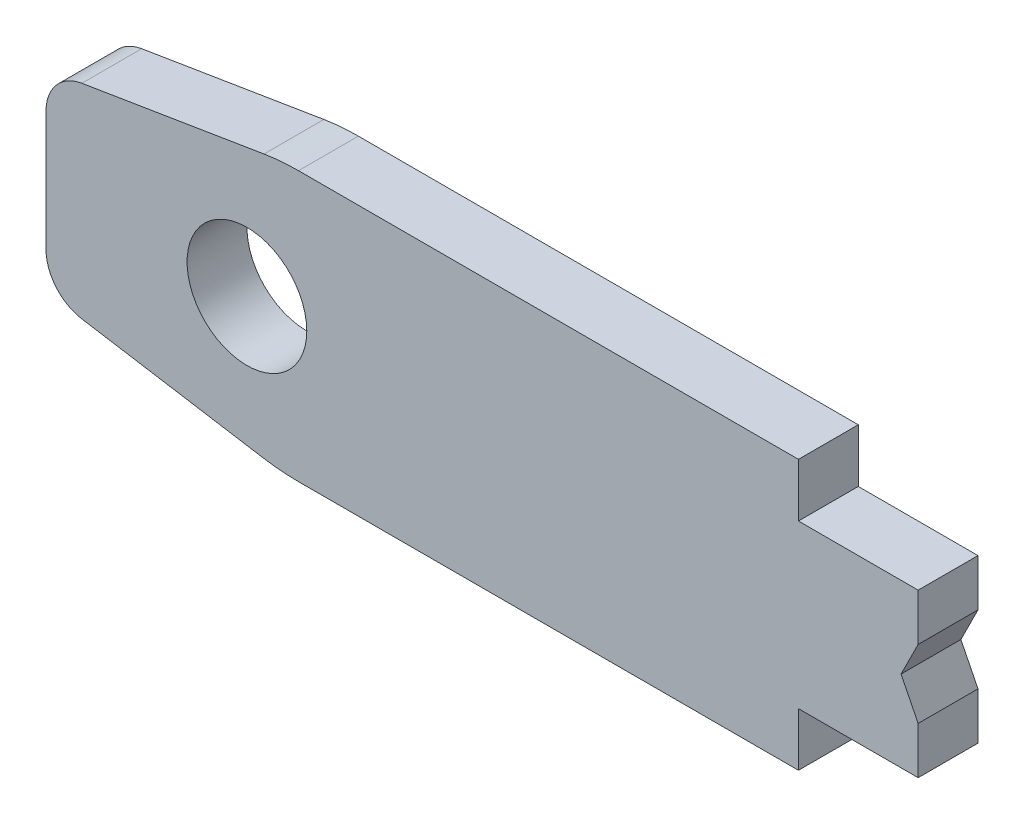
ISO-10303-21;
HEADER;
FILE_DESCRIPTION(('STEP AP214'),'2;1');
FILE_NAME('part.step','',(''),(''),'','','');
FILE_SCHEMA(('AUTOMOTIVE_DESIGN { 1 0 10303 214 1 1 1 1 }'));
ENDSEC;
DATA;
#1=APPLICATION_CONTEXT('core data for automotive mechanical design processes');
#2=APPLICATION_PROTOCOL_DEFINITION('international standard','automotive_design',2000,#1);
#3=PRODUCT_CONTEXT('',#1,'mechanical');
#4=PRODUCT('Part','Part','',(#3));
#5=PRODUCT_RELATED_PRODUCT_CATEGORY('part','',(#4));
#6=PRODUCT_DEFINITION_FORMATION('','',#4);
#7=PRODUCT_DEFINITION_CONTEXT('part definition',#1,'design');
#8=PRODUCT_DEFINITION('design','',#6,#7);
#9=PRODUCT_DEFINITION_SHAPE('','',#8);
#10=(LENGTH_UNIT() NAMED_UNIT(*) SI_UNIT(.MILLI.,.METRE.));
#11=(NAMED_UNIT(*) PLANE_ANGLE_UNIT() SI_UNIT($,.RADIAN.));
#12=(NAMED_UNIT(*) SI_UNIT($,.STERADIAN.) SOLID_ANGLE_UNIT());
#13=UNCERTAINTY_MEASURE_WITH_UNIT(LENGTH_MEASURE(1.E-05),#10,'distance_accuracy_value','');
#14=(GEOMETRIC_REPRESENTATION_CONTEXT(3) GLOBAL_UNCERTAINTY_ASSIGNED_CONTEXT((#13)) GLOBAL_UNIT_ASSIGNED_CONTEXT((#10,
#11,#12)) REPRESENTATION_CONTEXT('',''));
#15=CARTESIAN_POINT('',(0.,0.,0.));
#16=DIRECTION('',(0.,0.,1.));
#17=DIRECTION('',(1.,0.,0.));
#18=AXIS2_PLACEMENT_3D('',#15,#16,#17);
#19=CARTESIAN_POINT('',(-9.19999999999998,1.40033637868416,1.4));
#20=DIRECTION('',(0.,0.,1.));
#21=DIRECTION('',(1.,0.,0.));
#22=AXIS2_PLACEMENT_3D('',#19,#20,#21);
#23=PLANE('',#22);
#24=CARTESIAN_POINT('',(-9.19999999999998,1.40033637868416,1.4));
#25=DIRECTION('',(0.,0.,1.));
#26=DIRECTION('',(1.,0.,0.));
#27=AXIS2_PLACEMENT_3D('',#24,#25,#26);
#28=CIRCLE('',#27,1.);
#29=CARTESIAN_POINT('',(-9.36148856811052,2.38721096158191,1.4));
#30=VERTEX_POINT('',#29);
#31=CARTESIAN_POINT('',(-10.2,1.40033637868416,1.4));
#32=VERTEX_POINT('',#31);
#33=EDGE_CURVE('E216',#30,#32,#28,.T.);
#34=ORIENTED_EDGE('',*,*,#33,.T.);
#35=DIRECTION('',(0.,-1.,0.));
#36=VECTOR('',#35,1.);
#37=CARTESIAN_POINT('',(-10.2,-1.40033637868416,1.4));
#38=LINE('',#37,#36);
#39=CARTESIAN_POINT('',(-10.2,-1.40033637868416,1.4));
#40=VERTEX_POINT('',#39);
#41=EDGE_CURVE('E119',#32,#40,#38,.T.);
#42=ORIENTED_EDGE('',*,*,#41,.T.);
#43=CARTESIAN_POINT('',(-9.19999999999998,-1.40033637868416,1.4));
#44=DIRECTION('',(0.,0.,1.));
#45=DIRECTION('',(1.,0.,0.));
#46=AXIS2_PLACEMENT_3D('',#43,#44,#45);
#47=CIRCLE('',#46,1.);
#48=CARTESIAN_POINT('',(-9.36148856811052,-2.38721096158191,1.4));
#49=VERTEX_POINT('',#48);
#50=EDGE_CURVE('E258',#40,#49,#47,.T.);
#51=ORIENTED_EDGE('',*,*,#50,.T.);
#52=DIRECTION('',(0.98687458289775,-0.161488568110541,0.));
#53=VECTOR('',#52,1.);
#54=CARTESIAN_POINT('',(-9.36148856811052,-2.38721096158191,1.4));
#55=LINE('',#54,#53);
#56=CARTESIAN_POINT('',(-5.10105441145764,-3.08437291448875,1.4));
#57=VERTEX_POINT('',#56);
#58=EDGE_CURVE('E277',#49,#57,#55,.T.);
#59=ORIENTED_EDGE('',*,*,#58,.T.);
#60=CARTESIAN_POINT('',(-4.29361157090493,1.85,1.4));
#61=DIRECTION('',(0.,0.,1.));
#62=DIRECTION('',(1.,0.,0.));
#63=AXIS2_PLACEMENT_3D('',#60,#61,#62);
#64=CIRCLE('',#63,5.);
#65=CARTESIAN_POINT('',(-4.29361157090493,-3.15,1.4));
#66=VERTEX_POINT('',#65);
#67=EDGE_CURVE('E274',#57,#66,#64,.T.);
#68=ORIENTED_EDGE('',*,*,#67,.T.);
#69=DIRECTION('',(1.,0.,0.));
#70=VECTOR('',#69,1.);
#71=CARTESIAN_POINT('',(-4.29361157090493,-3.15,1.4));
#72=LINE('',#71,#70);
#73=CARTESIAN_POINT('',(7.40000000000002,-3.15,1.4));
#74=VERTEX_POINT('',#73);
#75=EDGE_CURVE('E276',#66,#74,#72,.T.);
#76=ORIENTED_EDGE('',*,*,#75,.T.);
#77=DIRECTION('',(0.,1.,0.));
#78=VECTOR('',#77,1.);
#79=CARTESIAN_POINT('',(7.40000000000002,-3.15,1.4));
#80=LINE('',#79,#78);
#81=CARTESIAN_POINT('',(7.40000000000002,-1.9,1.4));
#82=VERTEX_POINT('',#81);
#83=EDGE_CURVE('E279',#74,#82,#80,.T.);
#84=ORIENTED_EDGE('',*,*,#83,.T.);
#85=DIRECTION('',(1.,0.,0.));
#86=VECTOR('',#85,1.);
#87=CARTESIAN_POINT('',(10.2,-1.9,1.4));
#88=LINE('',#87,#86);
#89=CARTESIAN_POINT('',(10.2,-1.9,1.4));
#90=VERTEX_POINT('',#89);
#91=EDGE_CURVE('E285',#82,#90,#88,.T.);
#92=ORIENTED_EDGE('',*,*,#91,.T.);
#93=DIRECTION('',(0.,1.,0.));
#94=VECTOR('',#93,1.);
#95=CARTESIAN_POINT('',(10.2,-1.9,1.4));
#96=LINE('',#95,#94);
#97=CARTESIAN_POINT('',(10.2,-0.8,1.4));
#98=VERTEX_POINT('',#97);
#99=EDGE_CURVE('E287',#90,#98,#96,.T.);
#100=ORIENTED_EDGE('',*,*,#99,.T.);
#101=DIRECTION('',(-0.447213595499957,0.894427190999916,0.));
#102=VECTOR('',#101,1.);
#103=CARTESIAN_POINT('',(9.80000000000002,0.,1.4));
#104=LINE('',#103,#102);
#105=CARTESIAN_POINT('',(9.80000000000002,0.,1.4));
#106=VERTEX_POINT('',#105);
#107=EDGE_CURVE('E289',#98,#106,#104,.T.);
#108=ORIENTED_EDGE('',*,*,#107,.T.);
#109=DIRECTION('',(0.447213595499957,0.894427190999916,0.));
#110=VECTOR('',#109,1.);
#111=CARTESIAN_POINT('',(10.2,0.8,1.4));
#112=LINE('',#111,#110);
#113=CARTESIAN_POINT('',(10.2,0.8,1.4));
#114=VERTEX_POINT('',#113);
#115=EDGE_CURVE('E291',#106,#114,#112,.T.);
#116=ORIENTED_EDGE('',*,*,#115,.T.);
#117=DIRECTION('',(0.,1.,0.));
#118=VECTOR('',#117,1.);
#119=CARTESIAN_POINT('',(10.2,0.8,1.4));
#120=LINE('',#119,#118);
#121=CARTESIAN_POINT('',(10.2,1.9,1.4));
#122=VERTEX_POINT('',#121);
#123=EDGE_CURVE('E293',#114,#122,#120,.T.);
#124=ORIENTED_EDGE('',*,*,#123,.T.);
#125=DIRECTION('',(-1.,0.,0.));
#126=VECTOR('',#125,1.);
#127=CARTESIAN_POINT('',(7.40000000000002,1.9,1.4));
#128=LINE('',#127,#126);
#129=CARTESIAN_POINT('',(7.40000000000002,1.9,1.4));
#130=VERTEX_POINT('',#129);
#131=EDGE_CURVE('E295',#122,#130,#128,.T.);
#132=ORIENTED_EDGE('',*,*,#131,.T.);
#133=DIRECTION('',(0.,1.,0.));
#134=VECTOR('',#133,1.);
#135=CARTESIAN_POINT('',(7.40000000000002,3.15000000000002,1.4));
#136=LINE('',#135,#134);
#137=CARTESIAN_POINT('',(7.40000000000002,3.15000000000002,1.4));
#138=VERTEX_POINT('',#137);
#139=EDGE_CURVE('E165',#130,#138,#136,.T.);
#140=ORIENTED_EDGE('',*,*,#139,.T.);
#141=DIRECTION('',(-1.,0.,0.));
#142=VECTOR('',#141,1.);
#143=CARTESIAN_POINT('',(-4.29361157090493,3.15,1.4));
#144=LINE('',#143,#142);
#145=CARTESIAN_POINT('',(-4.29361157090493,3.15,1.4));
#146=VERTEX_POINT('',#145);
#147=EDGE_CURVE('E159',#138,#146,#144,.T.);
#148=ORIENTED_EDGE('',*,*,#147,.T.);
#149=CARTESIAN_POINT('',(-4.29361157090493,-1.85,1.4));
#150=DIRECTION('',(0.,0.,1.));
#151=DIRECTION('',(-1.,0.,0.));
#152=AXIS2_PLACEMENT_3D('',#149,#150,#151);
#153=CIRCLE('',#152,5.);
#154=CARTESIAN_POINT('',(-5.10105441145763,3.08437291448875,1.4));
#155=VERTEX_POINT('',#154);
#156=EDGE_CURVE('E163',#146,#155,#153,.T.);
#157=ORIENTED_EDGE('',*,*,#156,.T.);
#158=DIRECTION('',(-0.98687458289775,-0.16148856811054,0.));
#159=VECTOR('',#158,1.);
#160=CARTESIAN_POINT('',(-5.10105441145763,3.08437291448875,1.4));
#161=LINE('',#160,#159);
#162=EDGE_CURVE('E49',#155,#30,#161,.T.);
#163=ORIENTED_EDGE('',*,*,#162,.T.);
#164=EDGE_LOOP('',(#34,#42,#51,#59,#68,#76,#84,#92,#100,#108,#116,#124,#132,#140,#148,#157,#163));
#165=FACE_BOUND('',#164,.T.);
#166=CARTESIAN_POINT('',(-5.49999999999998,0.,1.4));
#167=DIRECTION('',(0.,0.,1.));
#168=DIRECTION('',(1.,0.,0.));
#169=AXIS2_PLACEMENT_3D('',#166,#167,#168);
#170=CIRCLE('',#169,1.4);
#171=CARTESIAN_POINT('',(-4.09999999999998,0.,1.4));
#172=VERTEX_POINT('',#171);
#173=EDGE_CURVE('E187',#172,#172,#170,.T.);
#174=ORIENTED_EDGE('',*,*,#173,.F.);
#175=EDGE_LOOP('',(#174));
#176=FACE_BOUND('',#175,.T.);
#177=ADVANCED_FACE('F32',(#165,#176),#23,.T.);
#178=CARTESIAN_POINT('',(-9.19999999999998,1.40033637868416,0.));
#179=DIRECTION('',(0.,0.,1.));
#180=DIRECTION('',(1.,0.,0.));
#181=AXIS2_PLACEMENT_3D('',#178,#179,#180);
#182=PLANE('',#181);
#183=CARTESIAN_POINT('',(-9.19999999999998,1.40033637868416,0.));
#184=DIRECTION('',(0.,0.,1.));
#185=DIRECTION('',(1.,0.,0.));
#186=AXIS2_PLACEMENT_3D('',#183,#184,#185);
#187=CIRCLE('',#186,1.);
#188=CARTESIAN_POINT('',(-9.36148856811052,2.38721096158191,0.));
#189=VERTEX_POINT('',#188);
#190=CARTESIAN_POINT('',(-10.2,1.40033637868416,0.));
#191=VERTEX_POINT('',#190);
#192=EDGE_CURVE('E183',#189,#191,#187,.T.);
#193=ORIENTED_EDGE('',*,*,#192,.F.);
#194=DIRECTION('',(-0.98687458289775,-0.16148856811054,0.));
#195=VECTOR('',#194,1.);
#196=CARTESIAN_POINT('',(-5.10105441145763,3.08437291448875,0.));
#197=LINE('',#196,#195);
#198=CARTESIAN_POINT('',(-5.10105441145763,3.08437291448875,0.));
#199=VERTEX_POINT('',#198);
#200=EDGE_CURVE('E111',#199,#189,#197,.T.);
#201=ORIENTED_EDGE('',*,*,#200,.F.);
#202=CARTESIAN_POINT('',(-4.29361157090493,-1.85,0.));
#203=DIRECTION('',(0.,0.,1.));
#204=DIRECTION('',(-1.,0.,0.));
#205=AXIS2_PLACEMENT_3D('',#202,#203,#204);
#206=CIRCLE('',#205,5.);
#207=CARTESIAN_POINT('',(-4.29361157090493,3.15,0.));
#208=VERTEX_POINT('',#207);
#209=EDGE_CURVE('E105',#208,#199,#206,.T.);
#210=ORIENTED_EDGE('',*,*,#209,.F.);
#211=DIRECTION('',(-1.,0.,0.));
#212=VECTOR('',#211,1.);
#213=CARTESIAN_POINT('',(-4.29361157090493,3.15,0.));
#214=LINE('',#213,#212);
#215=CARTESIAN_POINT('',(7.40000000000002,3.15000000000002,0.));
#216=VERTEX_POINT('',#215);
#217=EDGE_CURVE('E173',#216,#208,#214,.T.);
#218=ORIENTED_EDGE('',*,*,#217,.F.);
#219=DIRECTION('',(0.,1.,0.));
#220=VECTOR('',#219,1.);
#221=CARTESIAN_POINT('',(7.40000000000002,3.15000000000002,0.));
#222=LINE('',#221,#220);
#223=CARTESIAN_POINT('',(7.40000000000002,1.9,0.));
#224=VERTEX_POINT('',#223);
#225=EDGE_CURVE('E211',#224,#216,#222,.T.);
#226=ORIENTED_EDGE('',*,*,#225,.F.);
#227=DIRECTION('',(-1.,0.,0.));
#228=VECTOR('',#227,1.);
#229=CARTESIAN_POINT('',(7.40000000000002,1.9,0.));
#230=LINE('',#229,#228);
#231=CARTESIAN_POINT('',(10.2,1.9,0.));
#232=VERTEX_POINT('',#231);
#233=EDGE_CURVE('E209',#232,#224,#230,.T.);
#234=ORIENTED_EDGE('',*,*,#233,.F.);
#235=DIRECTION('',(0.,1.,0.));
#236=VECTOR('',#235,1.);
#237=CARTESIAN_POINT('',(10.2,0.8,0.));
#238=LINE('',#237,#236);
#239=CARTESIAN_POINT('',(10.2,0.8,0.));
#240=VERTEX_POINT('',#239);
#241=EDGE_CURVE('E207',#240,#232,#238,.T.);
#242=ORIENTED_EDGE('',*,*,#241,.F.);
#243=DIRECTION('',(0.447213595499957,0.894427190999916,0.));
#244=VECTOR('',#243,1.);
#245=CARTESIAN_POINT('',(10.2,0.8,0.));
#246=LINE('',#245,#244);
#247=CARTESIAN_POINT('',(9.80000000000002,0.,0.));
#248=VERTEX_POINT('',#247);
#249=EDGE_CURVE('E205',#248,#240,#246,.T.);
#250=ORIENTED_EDGE('',*,*,#249,.F.);
#251=DIRECTION('',(-0.447213595499957,0.894427190999916,0.));
#252=VECTOR('',#251,1.);
#253=CARTESIAN_POINT('',(9.80000000000002,0.,0.));
#254=LINE('',#253,#252);
#255=CARTESIAN_POINT('',(10.2,-0.8,0.));
#256=VERTEX_POINT('',#255);
#257=EDGE_CURVE('E203',#256,#248,#254,.T.);
#258=ORIENTED_EDGE('',*,*,#257,.F.);
#259=DIRECTION('',(0.,1.,0.));
#260=VECTOR('',#259,1.);
#261=CARTESIAN_POINT('',(10.2,-1.9,0.));
#262=LINE('',#261,#260);
#263=CARTESIAN_POINT('',(10.2,-1.9,0.));
#264=VERTEX_POINT('',#263);
#265=EDGE_CURVE('E201',#264,#256,#262,.T.);
#266=ORIENTED_EDGE('',*,*,#265,.F.);
#267=DIRECTION('',(1.,0.,0.));
#268=VECTOR('',#267,1.);
#269=CARTESIAN_POINT('',(10.2,-1.9,0.));
#270=LINE('',#269,#268);
#271=CARTESIAN_POINT('',(7.40000000000002,-1.9,0.));
#272=VERTEX_POINT('',#271);
#273=EDGE_CURVE('E199',#272,#264,#270,.T.);
#274=ORIENTED_EDGE('',*,*,#273,.F.);
#275=DIRECTION('',(0.,1.,0.));
#276=VECTOR('',#275,1.);
#277=CARTESIAN_POINT('',(7.40000000000002,-3.15,0.));
#278=LINE('',#277,#276);
#279=CARTESIAN_POINT('',(7.40000000000002,-3.15,0.));
#280=VERTEX_POINT('',#279);
#281=EDGE_CURVE('E197',#280,#272,#278,.T.);
#282=ORIENTED_EDGE('',*,*,#281,.F.);
#283=DIRECTION('',(1.,0.,0.));
#284=VECTOR('',#283,1.);
#285=CARTESIAN_POINT('',(-4.29361157090493,-3.15,0.));
#286=LINE('',#285,#284);
#287=CARTESIAN_POINT('',(-4.29361157090493,-3.15,0.));
#288=VERTEX_POINT('',#287);
#289=EDGE_CURVE('E195',#288,#280,#286,.T.);
#290=ORIENTED_EDGE('',*,*,#289,.F.);
#291=CARTESIAN_POINT('',(-4.29361157090493,1.85,0.));
#292=DIRECTION('',(0.,0.,1.));
#293=DIRECTION('',(1.,0.,0.));
#294=AXIS2_PLACEMENT_3D('',#291,#292,#293);
#295=CIRCLE('',#294,5.);
#296=CARTESIAN_POINT('',(-5.10105441145764,-3.08437291448875,0.));
#297=VERTEX_POINT('',#296);
#298=EDGE_CURVE('E193',#297,#288,#295,.T.);
#299=ORIENTED_EDGE('',*,*,#298,.F.);
#300=DIRECTION('',(0.98687458289775,-0.161488568110541,0.));
#301=VECTOR('',#300,1.);
#302=CARTESIAN_POINT('',(-9.36148856811052,-2.38721096158191,0.));
#303=LINE('',#302,#301);
#304=CARTESIAN_POINT('',(-9.36148856811052,-2.38721096158191,0.));
#305=VERTEX_POINT('',#304);
#306=EDGE_CURVE('E191',#305,#297,#303,.T.);
#307=ORIENTED_EDGE('',*,*,#306,.F.);
#308=CARTESIAN_POINT('',(-9.19999999999998,-1.40033637868416,0.));
#309=DIRECTION('',(0.,0.,1.));
#310=DIRECTION('',(1.,0.,0.));
#311=AXIS2_PLACEMENT_3D('',#308,#309,#310);
#312=CIRCLE('',#311,1.);
#313=CARTESIAN_POINT('',(-10.2,-1.40033637868416,0.));
#314=VERTEX_POINT('',#313);
#315=EDGE_CURVE('E189',#314,#305,#312,.T.);
#316=ORIENTED_EDGE('',*,*,#315,.F.);
#317=DIRECTION('',(0.,-1.,0.));
#318=VECTOR('',#317,1.);
#319=CARTESIAN_POINT('',(-10.2,-1.40033637868416,0.));
#320=LINE('',#319,#318);
#321=EDGE_CURVE('E186',#191,#314,#320,.T.);
#322=ORIENTED_EDGE('',*,*,#321,.F.);
#323=EDGE_LOOP('',(#193,#201,#210,#218,#226,#234,#242,#250,#258,#266,#274,#282,#290,#299,#307,
#316,#322));
#324=FACE_BOUND('',#323,.T.);
#325=CARTESIAN_POINT('',(-5.49999999999998,0.,0.));
#326=DIRECTION('',(0.,0.,1.));
#327=DIRECTION('',(1.,0.,0.));
#328=AXIS2_PLACEMENT_3D('',#325,#326,#327);
#329=CIRCLE('',#328,1.4);
#330=CARTESIAN_POINT('',(-4.09999999999998,0.,0.));
#331=VERTEX_POINT('',#330);
#332=EDGE_CURVE('E507',#331,#331,#329,.T.);
#333=ORIENTED_EDGE('',*,*,#332,.T.);
#334=EDGE_LOOP('',(#333));
#335=FACE_BOUND('',#334,.T.);
#336=ADVANCED_FACE('F262',(#324,#335),#182,.F.);
#337=CARTESIAN_POINT('',(-9.19999999999998,1.40033637868416,1.4));
#338=DIRECTION('',(0.,0.,-1.));
#339=DIRECTION('',(-1.,0.,0.));
#340=AXIS2_PLACEMENT_3D('',#337,#338,#339);
#341=CYLINDRICAL_SURFACE('',#340,1.);
#342=ORIENTED_EDGE('',*,*,#192,.T.);
#343=DIRECTION('',(0.,0.,-1.));
#344=VECTOR('',#343,1.);
#345=CARTESIAN_POINT('',(-10.2,1.40033637868416,1.4));
#346=LINE('',#345,#344);
#347=EDGE_CURVE('E11',#32,#191,#346,.T.);
#348=ORIENTED_EDGE('',*,*,#347,.F.);
#349=ORIENTED_EDGE('',*,*,#33,.F.);
#350=DIRECTION('',(0.,0.,-1.));
#351=VECTOR('',#350,1.);
#352=CARTESIAN_POINT('',(-9.36148856811052,2.38721096158191,1.4));
#353=LINE('',#352,#351);
#354=EDGE_CURVE('E179',#30,#189,#353,.T.);
#355=ORIENTED_EDGE('',*,*,#354,.T.);
#356=EDGE_LOOP('',(#342,#348,#349,#355));
#357=FACE_BOUND('',#356,.T.);
#358=ADVANCED_FACE('F34',(#357),#341,.T.);
#359=CARTESIAN_POINT('',(-10.2,-1.40033637868416,1.4));
#360=DIRECTION('',(1.,0.,0.));
#361=DIRECTION('',(0.,0.,-1.));
#362=AXIS2_PLACEMENT_3D('',#359,#360,#361);
#363=PLANE('',#362);
#364=ORIENTED_EDGE('',*,*,#321,.T.);
#365=DIRECTION('',(0.,0.,-1.));
#366=VECTOR('',#365,1.);
#367=CARTESIAN_POINT('',(-10.2,-1.40033637868416,1.4));
#368=LINE('',#367,#366);
#369=EDGE_CURVE('E41',#40,#314,#368,.T.);
#370=ORIENTED_EDGE('',*,*,#369,.F.);
#371=ORIENTED_EDGE('',*,*,#41,.F.);
#372=ORIENTED_EDGE('',*,*,#347,.T.);
#373=EDGE_LOOP('',(#364,#370,#371,#372));
#374=FACE_BOUND('',#373,.T.);
#375=ADVANCED_FACE('F329',(#374),#363,.F.);
#376=CARTESIAN_POINT('',(-9.19999999999998,-1.40033637868416,1.4));
#377=DIRECTION('',(0.,0.,-1.));
#378=DIRECTION('',(-1.,0.,0.));
#379=AXIS2_PLACEMENT_3D('',#376,#377,#378);
#380=CYLINDRICAL_SURFACE('',#379,1.);
#381=ORIENTED_EDGE('',*,*,#315,.T.);
#382=DIRECTION('',(0.,0.,-1.));
#383=VECTOR('',#382,1.);
#384=CARTESIAN_POINT('',(-9.36148856811052,-2.38721096158191,1.4));
#385=LINE('',#384,#383);
#386=EDGE_CURVE('E250',#49,#305,#385,.T.);
#387=ORIENTED_EDGE('',*,*,#386,.F.);
#388=ORIENTED_EDGE('',*,*,#50,.F.);
#389=ORIENTED_EDGE('',*,*,#369,.T.);
#390=EDGE_LOOP('',(#381,#387,#388,#389));
#391=FACE_BOUND('',#390,.T.);
#392=ADVANCED_FACE('F256',(#391),#380,.T.);
#393=CARTESIAN_POINT('',(-9.36148856811052,-2.38721096158191,1.4));
#394=DIRECTION('',(0.161488568110541,0.98687458289775,0.));
#395=DIRECTION('',(-0.98687458289775,0.161488568110541,0.));
#396=AXIS2_PLACEMENT_3D('',#393,#394,#395);
#397=PLANE('',#396);
#398=ORIENTED_EDGE('',*,*,#306,.T.);
#399=DIRECTION('',(0.,0.,-1.));
#400=VECTOR('',#399,1.);
#401=CARTESIAN_POINT('',(-5.10105441145764,-3.08437291448875,1.4));
#402=LINE('',#401,#400);
#403=EDGE_CURVE('E247',#57,#297,#402,.T.);
#404=ORIENTED_EDGE('',*,*,#403,.F.);
#405=ORIENTED_EDGE('',*,*,#58,.F.);
#406=ORIENTED_EDGE('',*,*,#386,.T.);
#407=EDGE_LOOP('',(#398,#404,#405,#406));
#408=FACE_BOUND('',#407,.T.);
#409=ADVANCED_FACE('F268',(#408),#397,.F.);
#410=CARTESIAN_POINT('',(-4.29361157090493,1.85,1.4));
#411=DIRECTION('',(0.,0.,-1.));
#412=DIRECTION('',(-1.,0.,0.));
#413=AXIS2_PLACEMENT_3D('',#410,#411,#412);
#414=CYLINDRICAL_SURFACE('',#413,5.);
#415=ORIENTED_EDGE('',*,*,#298,.T.);
#416=DIRECTION('',(0.,0.,-1.));
#417=VECTOR('',#416,1.);
#418=CARTESIAN_POINT('',(-4.29361157090493,-3.15,1.4));
#419=LINE('',#418,#417);
#420=EDGE_CURVE('E244',#66,#288,#419,.T.);
#421=ORIENTED_EDGE('',*,*,#420,.F.);
#422=ORIENTED_EDGE('',*,*,#67,.F.);
#423=ORIENTED_EDGE('',*,*,#403,.T.);
#424=EDGE_LOOP('',(#415,#421,#422,#423));
#425=FACE_BOUND('',#424,.T.);
#426=ADVANCED_FACE('F272',(#425),#414,.T.);
#427=CARTESIAN_POINT('',(-4.29361157090493,-3.15,1.4));
#428=DIRECTION('',(0.,1.,0.));
#429=DIRECTION('',(0.,0.,1.));
#430=AXIS2_PLACEMENT_3D('',#427,#428,#429);
#431=PLANE('',#430);
#432=ORIENTED_EDGE('',*,*,#289,.T.);
#433=DIRECTION('',(0.,0.,-1.));
#434=VECTOR('',#433,1.);
#435=CARTESIAN_POINT('',(7.40000000000002,-3.15,1.4));
#436=LINE('',#435,#434);
#437=EDGE_CURVE('E241',#74,#280,#436,.T.);
#438=ORIENTED_EDGE('',*,*,#437,.F.);
#439=ORIENTED_EDGE('',*,*,#75,.F.);
#440=ORIENTED_EDGE('',*,*,#420,.T.);
#441=EDGE_LOOP('',(#432,#438,#439,#440));
#442=FACE_BOUND('',#441,.T.);
#443=ADVANCED_FACE('F342',(#442),#431,.F.);
#444=CARTESIAN_POINT('',(7.40000000000002,-3.15,1.4));
#445=DIRECTION('',(-1.,0.,0.));
#446=DIRECTION('',(0.,0.,1.));
#447=AXIS2_PLACEMENT_3D('',#444,#445,#446);
#448=PLANE('',#447);
#449=ORIENTED_EDGE('',*,*,#281,.T.);
#450=DIRECTION('',(0.,0.,-1.));
#451=VECTOR('',#450,1.);
#452=CARTESIAN_POINT('',(7.40000000000002,-1.9,1.4));
#453=LINE('',#452,#451);
#454=EDGE_CURVE('E238',#82,#272,#453,.T.);
#455=ORIENTED_EDGE('',*,*,#454,.F.);
#456=ORIENTED_EDGE('',*,*,#83,.F.);
#457=ORIENTED_EDGE('',*,*,#437,.T.);
#458=EDGE_LOOP('',(#449,#455,#456,#457));
#459=FACE_BOUND('',#458,.T.);
#460=ADVANCED_FACE('F345',(#459),#448,.F.);
#461=CARTESIAN_POINT('',(10.2,-1.9,1.4));
#462=DIRECTION('',(0.,1.,0.));
#463=DIRECTION('',(-1.,0.,0.));
#464=AXIS2_PLACEMENT_3D('',#461,#462,#463);
#465=PLANE('',#464);
#466=ORIENTED_EDGE('',*,*,#273,.T.);
#467=DIRECTION('',(0.,0.,-1.));
#468=VECTOR('',#467,1.);
#469=CARTESIAN_POINT('',(10.2,-1.9,1.4));
#470=LINE('',#469,#468);
#471=EDGE_CURVE('E235',#90,#264,#470,.T.);
#472=ORIENTED_EDGE('',*,*,#471,.F.);
#473=ORIENTED_EDGE('',*,*,#91,.F.);
#474=ORIENTED_EDGE('',*,*,#454,.T.);
#475=EDGE_LOOP('',(#466,#472,#473,#474));
#476=FACE_BOUND('',#475,.T.);
#477=ADVANCED_FACE('F349',(#476),#465,.F.);
#478=CARTESIAN_POINT('',(10.2,-1.9,1.4));
#479=DIRECTION('',(-1.,0.,0.));
#480=DIRECTION('',(0.,0.,1.));
#481=AXIS2_PLACEMENT_3D('',#478,#479,#480);
#482=PLANE('',#481);
#483=ORIENTED_EDGE('',*,*,#265,.T.);
#484=DIRECTION('',(0.,0.,-1.));
#485=VECTOR('',#484,1.);
#486=CARTESIAN_POINT('',(10.2,-0.8,1.4));
#487=LINE('',#486,#485);
#488=EDGE_CURVE('E232',#98,#256,#487,.T.);
#489=ORIENTED_EDGE('',*,*,#488,.F.);
#490=ORIENTED_EDGE('',*,*,#99,.F.);
#491=ORIENTED_EDGE('',*,*,#471,.T.);
#492=EDGE_LOOP('',(#483,#489,#490,#491));
#493=FACE_BOUND('',#492,.T.);
#494=ADVANCED_FACE('F353',(#493),#482,.F.);
#495=CARTESIAN_POINT('',(9.80000000000002,0.,1.4));
#496=DIRECTION('',(-0.894427190999916,-0.447213595499957,0.));
#497=DIRECTION('',(0.447213595499957,-0.894427190999916,0.));
#498=AXIS2_PLACEMENT_3D('',#495,#496,#497);
#499=PLANE('',#498);
#500=ORIENTED_EDGE('',*,*,#257,.T.);
#501=DIRECTION('',(0.,0.,-1.));
#502=VECTOR('',#501,1.);
#503=CARTESIAN_POINT('',(9.80000000000002,0.,1.4));
#504=LINE('',#503,#502);
#505=EDGE_CURVE('E229',#106,#248,#504,.T.);
#506=ORIENTED_EDGE('',*,*,#505,.F.);
#507=ORIENTED_EDGE('',*,*,#107,.F.);
#508=ORIENTED_EDGE('',*,*,#488,.T.);
#509=EDGE_LOOP('',(#500,#506,#507,#508));
#510=FACE_BOUND('',#509,.T.);
#511=ADVANCED_FACE('F357',(#510),#499,.F.);
#512=CARTESIAN_POINT('',(10.2,0.8,1.4));
#513=DIRECTION('',(-0.894427190999916,0.447213595499957,0.));
#514=DIRECTION('',(-0.447213595499957,-0.894427190999916,0.));
#515=AXIS2_PLACEMENT_3D('',#512,#513,#514);
#516=PLANE('',#515);
#517=ORIENTED_EDGE('',*,*,#249,.T.);
#518=DIRECTION('',(0.,0.,-1.));
#519=VECTOR('',#518,1.);
#520=CARTESIAN_POINT('',(10.2,0.8,1.4));
#521=LINE('',#520,#519);
#522=EDGE_CURVE('E226',#114,#240,#521,.T.);
#523=ORIENTED_EDGE('',*,*,#522,.F.);
#524=ORIENTED_EDGE('',*,*,#115,.F.);
#525=ORIENTED_EDGE('',*,*,#505,.T.);
#526=EDGE_LOOP('',(#517,#523,#524,#525));
#527=FACE_BOUND('',#526,.T.);
#528=ADVANCED_FACE('F361',(#527),#516,.F.);
#529=CARTESIAN_POINT('',(10.2,0.8,1.4));
#530=DIRECTION('',(-1.,0.,0.));
#531=DIRECTION('',(0.,-1.,0.));
#532=AXIS2_PLACEMENT_3D('',#529,#530,#531);
#533=PLANE('',#532);
#534=ORIENTED_EDGE('',*,*,#241,.T.);
#535=DIRECTION('',(0.,0.,-1.));
#536=VECTOR('',#535,1.);
#537=CARTESIAN_POINT('',(10.2,1.9,1.4));
#538=LINE('',#537,#536);
#539=EDGE_CURVE('E223',#122,#232,#538,.T.);
#540=ORIENTED_EDGE('',*,*,#539,.F.);
#541=ORIENTED_EDGE('',*,*,#123,.F.);
#542=ORIENTED_EDGE('',*,*,#522,.T.);
#543=EDGE_LOOP('',(#534,#540,#541,#542));
#544=FACE_BOUND('',#543,.T.);
#545=ADVANCED_FACE('F365',(#544),#533,.F.);
#546=CARTESIAN_POINT('',(7.40000000000002,1.9,1.4));
#547=DIRECTION('',(0.,-1.,0.));
#548=DIRECTION('',(0.,0.,-1.));
#549=AXIS2_PLACEMENT_3D('',#546,#547,#548);
#550=PLANE('',#549);
#551=ORIENTED_EDGE('',*,*,#233,.T.);
#552=DIRECTION('',(0.,0.,-1.));
#553=VECTOR('',#552,1.);
#554=CARTESIAN_POINT('',(7.40000000000002,1.9,1.4));
#555=LINE('',#554,#553);
#556=EDGE_CURVE('E220',#130,#224,#555,.T.);
#557=ORIENTED_EDGE('',*,*,#556,.F.);
#558=ORIENTED_EDGE('',*,*,#131,.F.);
#559=ORIENTED_EDGE('',*,*,#539,.T.);
#560=EDGE_LOOP('',(#551,#557,#558,#559));
#561=FACE_BOUND('',#560,.T.);
#562=ADVANCED_FACE('F301',(#561),#550,.F.);
#563=CARTESIAN_POINT('',(7.40000000000002,3.15000000000002,1.4));
#564=DIRECTION('',(-1.,0.,0.));
#565=DIRECTION('',(0.,-1.,0.));
#566=AXIS2_PLACEMENT_3D('',#563,#564,#565);
#567=PLANE('',#566);
#568=ORIENTED_EDGE('',*,*,#225,.T.);
#569=DIRECTION('',(0.,0.,-1.));
#570=VECTOR('',#569,1.);
#571=CARTESIAN_POINT('',(7.40000000000002,3.15000000000002,1.4));
#572=LINE('',#571,#570);
#573=EDGE_CURVE('E174',#138,#216,#572,.T.);
#574=ORIENTED_EDGE('',*,*,#573,.F.);
#575=ORIENTED_EDGE('',*,*,#139,.F.);
#576=ORIENTED_EDGE('',*,*,#556,.T.);
#577=EDGE_LOOP('',(#568,#574,#575,#576));
#578=FACE_BOUND('',#577,.T.);
#579=ADVANCED_FACE('F305',(#578),#567,.F.);
#580=CARTESIAN_POINT('',(-4.29361157090493,3.15,1.4));
#581=DIRECTION('',(0.,-1.,0.));
#582=DIRECTION('',(1.,0.,0.));
#583=AXIS2_PLACEMENT_3D('',#580,#581,#582);
#584=PLANE('',#583);
#585=ORIENTED_EDGE('',*,*,#217,.T.);
#586=DIRECTION('',(0.,0.,-1.));
#587=VECTOR('',#586,1.);
#588=CARTESIAN_POINT('',(-4.29361157090493,3.15,1.4));
#589=LINE('',#588,#587);
#590=EDGE_CURVE('E170',#146,#208,#589,.T.);
#591=ORIENTED_EDGE('',*,*,#590,.F.);
#592=ORIENTED_EDGE('',*,*,#147,.F.);
#593=ORIENTED_EDGE('',*,*,#573,.T.);
#594=EDGE_LOOP('',(#585,#591,#592,#593));
#595=FACE_BOUND('',#594,.T.);
#596=ADVANCED_FACE('F171',(#595),#584,.F.);
#597=CARTESIAN_POINT('',(-4.29361157090493,-1.85,1.4));
#598=DIRECTION('',(0.,0.,-1.));
#599=DIRECTION('',(-1.,0.,0.));
#600=AXIS2_PLACEMENT_3D('',#597,#598,#599);
#601=CYLINDRICAL_SURFACE('',#600,5.);
#602=ORIENTED_EDGE('',*,*,#209,.T.);
#603=DIRECTION('',(0.,0.,-1.));
#604=VECTOR('',#603,1.);
#605=CARTESIAN_POINT('',(-5.10105441145763,3.08437291448875,1.4));
#606=LINE('',#605,#604);
#607=EDGE_CURVE('E175',#155,#199,#606,.T.);
#608=ORIENTED_EDGE('',*,*,#607,.F.);
#609=ORIENTED_EDGE('',*,*,#156,.F.);
#610=ORIENTED_EDGE('',*,*,#590,.T.);
#611=EDGE_LOOP('',(#602,#608,#609,#610));
#612=FACE_BOUND('',#611,.T.);
#613=ADVANCED_FACE('F177',(#612),#601,.T.);
#614=CARTESIAN_POINT('',(-5.10105441145763,3.08437291448875,1.4));
#615=DIRECTION('',(0.16148856811054,-0.98687458289775,0.));
#616=DIRECTION('',(0.98687458289775,0.16148856811054,0.));
#617=AXIS2_PLACEMENT_3D('',#614,#615,#616);
#618=PLANE('',#617);
#619=ORIENTED_EDGE('',*,*,#200,.T.);
#620=ORIENTED_EDGE('',*,*,#354,.F.);
#621=ORIENTED_EDGE('',*,*,#162,.F.);
#622=ORIENTED_EDGE('',*,*,#607,.T.);
#623=EDGE_LOOP('',(#619,#620,#621,#622));
#624=FACE_BOUND('',#623,.T.);
#625=ADVANCED_FACE('F309',(#624),#618,.F.);
#626=CARTESIAN_POINT('',(-5.49999999999998,0.,1.4));
#627=DIRECTION('',(0.,0.,-1.));
#628=DIRECTION('',(-1.,0.,0.));
#629=AXIS2_PLACEMENT_3D('',#626,#627,#628);
#630=CYLINDRICAL_SURFACE('',#629,1.4);
#631=ORIENTED_EDGE('',*,*,#173,.T.);
#632=EDGE_LOOP('',(#631));
#633=FACE_BOUND('',#632,.T.);
#634=ORIENTED_EDGE('',*,*,#332,.F.);
#635=EDGE_LOOP('',(#634));
#636=FACE_BOUND('',#635,.T.);
#637=ADVANCED_FACE('F311',(#633,#636),#630,.F.);
#638=CLOSED_SHELL('',(#177,#336,#358,#375,#392,#409,#426,#443,#460,#477,#494,#511,#528,#545,
#562,#579,#596,#613,#625,#637));
#639=MANIFOLD_SOLID_BREP('B2',#638);
#640=ADVANCED_BREP_SHAPE_REPRESENTATION('',(#18,#639),#14);
#641=SHAPE_DEFINITION_REPRESENTATION(#9,#640);
ENDSEC;
END-ISO-10303-21;
